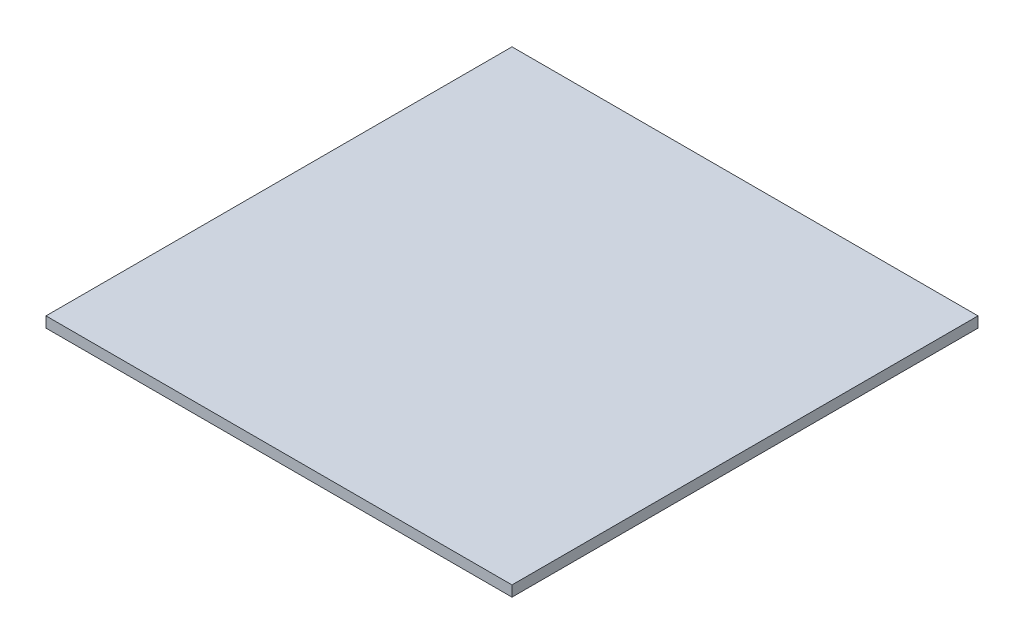
ISO-10303-21;
HEADER;
FILE_DESCRIPTION(('STEP AP214'),'2;1');
FILE_NAME('part.step','',(''),(''),'','','');
FILE_SCHEMA(('AUTOMOTIVE_DESIGN { 1 0 10303 214 1 1 1 1 }'));
ENDSEC;
DATA;
#1=APPLICATION_CONTEXT('core data for automotive mechanical design processes');
#2=APPLICATION_PROTOCOL_DEFINITION('international standard','automotive_design',2000,#1);
#3=PRODUCT_CONTEXT('',#1,'mechanical');
#4=PRODUCT('Part','Part','',(#3));
#5=PRODUCT_RELATED_PRODUCT_CATEGORY('part','',(#4));
#6=PRODUCT_DEFINITION_FORMATION('','',#4);
#7=PRODUCT_DEFINITION_CONTEXT('part definition',#1,'design');
#8=PRODUCT_DEFINITION('design','',#6,#7);
#9=PRODUCT_DEFINITION_SHAPE('','',#8);
#10=(LENGTH_UNIT() NAMED_UNIT(*) SI_UNIT(.MILLI.,.METRE.));
#11=(NAMED_UNIT(*) PLANE_ANGLE_UNIT() SI_UNIT($,.RADIAN.));
#12=(NAMED_UNIT(*) SI_UNIT($,.STERADIAN.) SOLID_ANGLE_UNIT());
#13=UNCERTAINTY_MEASURE_WITH_UNIT(LENGTH_MEASURE(1.E-05),#10,'distance_accuracy_value','');
#14=(GEOMETRIC_REPRESENTATION_CONTEXT(3) GLOBAL_UNCERTAINTY_ASSIGNED_CONTEXT((#13)) GLOBAL_UNIT_ASSIGNED_CONTEXT((#10,
#11,#12)) REPRESENTATION_CONTEXT('',''));
#15=CARTESIAN_POINT('',(0.,0.,0.));
#16=DIRECTION('',(0.,0.,1.));
#17=DIRECTION('',(1.,0.,0.));
#18=AXIS2_PLACEMENT_3D('',#15,#16,#17);
#19=CARTESIAN_POINT('',(-109.5,5.,109.5));
#20=DIRECTION('',(0.,0.,-1.));
#21=DIRECTION('',(-1.,0.,0.));
#22=AXIS2_PLACEMENT_3D('',#19,#20,#21);
#23=PLANE('',#22);
#24=DIRECTION('',(1.,0.,0.));
#25=VECTOR('',#24,1.);
#26=CARTESIAN_POINT('',(-109.5,0.,109.5));
#27=LINE('',#26,#25);
#28=CARTESIAN_POINT('',(-109.5,0.,109.5));
#29=VERTEX_POINT('',#28);
#30=CARTESIAN_POINT('',(109.5,0.,109.5));
#31=VERTEX_POINT('',#30);
#32=EDGE_CURVE('E95',#29,#31,#27,.T.);
#33=ORIENTED_EDGE('',*,*,#32,.T.);
#34=DIRECTION('',(0.,-1.,0.));
#35=VECTOR('',#34,1.);
#36=CARTESIAN_POINT('',(109.5,5.,109.5));
#37=LINE('',#36,#35);
#38=CARTESIAN_POINT('',(109.5,5.,109.5));
#39=VERTEX_POINT('',#38);
#40=EDGE_CURVE('E11',#39,#31,#37,.T.);
#41=ORIENTED_EDGE('',*,*,#40,.F.);
#42=DIRECTION('',(1.,0.,0.));
#43=VECTOR('',#42,1.);
#44=CARTESIAN_POINT('',(-109.5,5.,109.5));
#45=LINE('',#44,#43);
#46=CARTESIAN_POINT('',(-109.5,5.,109.5));
#47=VERTEX_POINT('',#46);
#48=EDGE_CURVE('E83',#47,#39,#45,.T.);
#49=ORIENTED_EDGE('',*,*,#48,.F.);
#50=DIRECTION('',(0.,-1.,0.));
#51=VECTOR('',#50,1.);
#52=CARTESIAN_POINT('',(-109.5,5.,109.5));
#53=LINE('',#52,#51);
#54=EDGE_CURVE('E91',#47,#29,#53,.T.);
#55=ORIENTED_EDGE('',*,*,#54,.T.);
#56=EDGE_LOOP('',(#33,#41,#49,#55));
#57=FACE_BOUND('',#56,.T.);
#58=ADVANCED_FACE('F32',(#57),#23,.F.);
#59=CARTESIAN_POINT('',(109.5,5.,109.5));
#60=DIRECTION('',(-1.,0.,0.));
#61=DIRECTION('',(0.,0.,1.));
#62=AXIS2_PLACEMENT_3D('',#59,#60,#61);
#63=PLANE('',#62);
#64=DIRECTION('',(0.,0.,-1.));
#65=VECTOR('',#64,1.);
#66=CARTESIAN_POINT('',(109.5,0.,109.5));
#67=LINE('',#66,#65);
#68=CARTESIAN_POINT('',(109.5,0.,-109.5));
#69=VERTEX_POINT('',#68);
#70=EDGE_CURVE('E87',#31,#69,#67,.T.);
#71=ORIENTED_EDGE('',*,*,#70,.T.);
#72=DIRECTION('',(0.,-1.,0.));
#73=VECTOR('',#72,1.);
#74=CARTESIAN_POINT('',(109.5,5.,-109.5));
#75=LINE('',#74,#73);
#76=CARTESIAN_POINT('',(109.5,5.,-109.5));
#77=VERTEX_POINT('',#76);
#78=EDGE_CURVE('E40',#77,#69,#75,.T.);
#79=ORIENTED_EDGE('',*,*,#78,.F.);
#80=DIRECTION('',(0.,0.,-1.));
#81=VECTOR('',#80,1.);
#82=CARTESIAN_POINT('',(109.5,5.,109.5));
#83=LINE('',#82,#81);
#84=EDGE_CURVE('E78',#39,#77,#83,.T.);
#85=ORIENTED_EDGE('',*,*,#84,.F.);
#86=ORIENTED_EDGE('',*,*,#40,.T.);
#87=EDGE_LOOP('',(#71,#79,#85,#86));
#88=FACE_BOUND('',#87,.T.);
#89=ADVANCED_FACE('F86',(#88),#63,.F.);
#90=CARTESIAN_POINT('',(109.5,5.,-109.5));
#91=DIRECTION('',(0.,0.,1.));
#92=DIRECTION('',(1.,0.,0.));
#93=AXIS2_PLACEMENT_3D('',#90,#91,#92);
#94=PLANE('',#93);
#95=DIRECTION('',(-1.,0.,0.));
#96=VECTOR('',#95,1.);
#97=CARTESIAN_POINT('',(109.5,0.,-109.5));
#98=LINE('',#97,#96);
#99=CARTESIAN_POINT('',(-109.5,0.,-109.5));
#100=VERTEX_POINT('',#99);
#101=EDGE_CURVE('E65',#69,#100,#98,.T.);
#102=ORIENTED_EDGE('',*,*,#101,.T.);
#103=DIRECTION('',(0.,-1.,0.));
#104=VECTOR('',#103,1.);
#105=CARTESIAN_POINT('',(-109.5,5.,-109.5));
#106=LINE('',#105,#104);
#107=CARTESIAN_POINT('',(-109.5,5.,-109.5));
#108=VERTEX_POINT('',#107);
#109=EDGE_CURVE('E88',#108,#100,#106,.T.);
#110=ORIENTED_EDGE('',*,*,#109,.F.);
#111=DIRECTION('',(-1.,0.,0.));
#112=VECTOR('',#111,1.);
#113=CARTESIAN_POINT('',(109.5,5.,-109.5));
#114=LINE('',#113,#112);
#115=EDGE_CURVE('E81',#77,#108,#114,.T.);
#116=ORIENTED_EDGE('',*,*,#115,.F.);
#117=ORIENTED_EDGE('',*,*,#78,.T.);
#118=EDGE_LOOP('',(#102,#110,#116,#117));
#119=FACE_BOUND('',#118,.T.);
#120=ADVANCED_FACE('F89',(#119),#94,.F.);
#121=CARTESIAN_POINT('',(-109.5,5.,-109.5));
#122=DIRECTION('',(1.,0.,0.));
#123=DIRECTION('',(0.,0.,-1.));
#124=AXIS2_PLACEMENT_3D('',#121,#122,#123);
#125=PLANE('',#124);
#126=DIRECTION('',(0.,0.,1.));
#127=VECTOR('',#126,1.);
#128=CARTESIAN_POINT('',(-109.5,0.,-109.5));
#129=LINE('',#128,#127);
#130=EDGE_CURVE('E71',#100,#29,#129,.T.);
#131=ORIENTED_EDGE('',*,*,#130,.T.);
#132=ORIENTED_EDGE('',*,*,#54,.F.);
#133=DIRECTION('',(0.,0.,1.));
#134=VECTOR('',#133,1.);
#135=CARTESIAN_POINT('',(-109.5,5.,-109.5));
#136=LINE('',#135,#134);
#137=EDGE_CURVE('E48',#108,#47,#136,.T.);
#138=ORIENTED_EDGE('',*,*,#137,.F.);
#139=ORIENTED_EDGE('',*,*,#109,.T.);
#140=EDGE_LOOP('',(#131,#132,#138,#139));
#141=FACE_BOUND('',#140,.T.);
#142=ADVANCED_FACE('F102',(#141),#125,.F.);
#143=CARTESIAN_POINT('',(0.,5.,0.));
#144=DIRECTION('',(0.,1.,0.));
#145=DIRECTION('',(0.,0.,1.));
#146=AXIS2_PLACEMENT_3D('',#143,#144,#145);
#147=PLANE('',#146);
#148=ORIENTED_EDGE('',*,*,#48,.T.);
#149=ORIENTED_EDGE('',*,*,#84,.T.);
#150=ORIENTED_EDGE('',*,*,#115,.T.);
#151=ORIENTED_EDGE('',*,*,#137,.T.);
#152=EDGE_LOOP('',(#148,#149,#150,#151));
#153=FACE_BOUND('',#152,.T.);
#154=ADVANCED_FACE('F79',(#153),#147,.T.);
#155=CARTESIAN_POINT('',(0.,0.,0.));
#156=DIRECTION('',(0.,1.,0.));
#157=DIRECTION('',(0.,0.,1.));
#158=AXIS2_PLACEMENT_3D('',#155,#156,#157);
#159=PLANE('',#158);
#160=ORIENTED_EDGE('',*,*,#32,.F.);
#161=ORIENTED_EDGE('',*,*,#130,.F.);
#162=ORIENTED_EDGE('',*,*,#101,.F.);
#163=ORIENTED_EDGE('',*,*,#70,.F.);
#164=EDGE_LOOP('',(#160,#161,#162,#163));
#165=FACE_BOUND('',#164,.T.);
#166=ADVANCED_FACE('F105',(#165),#159,.F.);
#167=CLOSED_SHELL('',(#58,#89,#120,#142,#154,#166));
#168=MANIFOLD_SOLID_BREP('B2',#167);
#169=ADVANCED_BREP_SHAPE_REPRESENTATION('',(#18,#168),#14);
#170=SHAPE_DEFINITION_REPRESENTATION(#9,#169);
ENDSEC;
END-ISO-10303-21;
